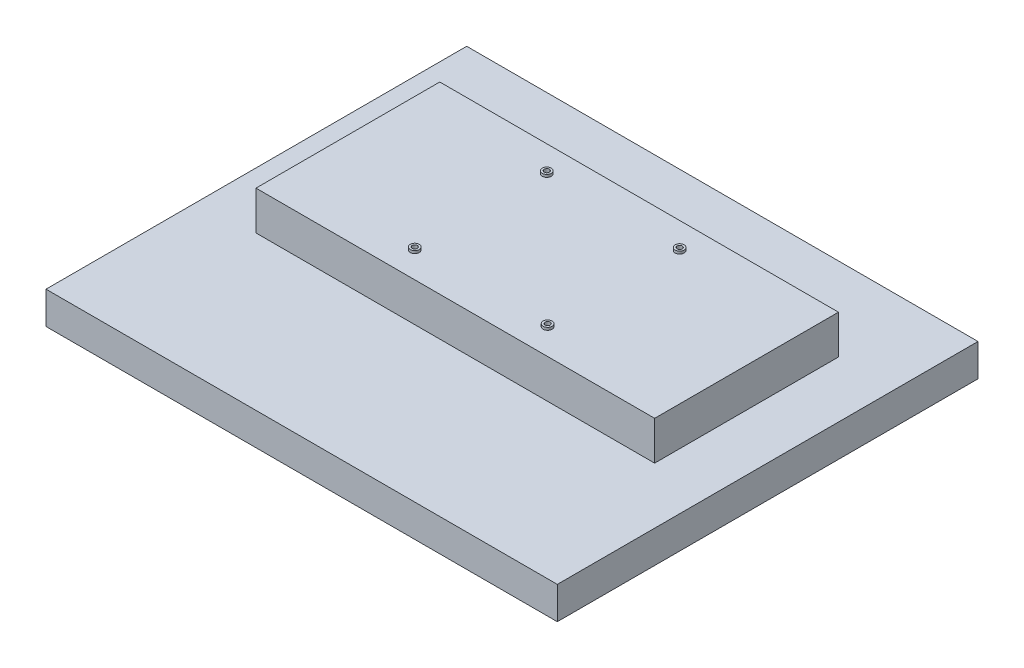
ISO-10303-21;
HEADER;
FILE_DESCRIPTION(('STEP AP214'),'2;1');
FILE_NAME('part.step','',(''),(''),'','','');
FILE_SCHEMA(('AUTOMOTIVE_DESIGN { 1 0 10303 214 1 1 1 1 }'));
ENDSEC;
DATA;
#1=APPLICATION_CONTEXT('core data for automotive mechanical design processes');
#2=APPLICATION_PROTOCOL_DEFINITION('international standard','automotive_design',2000,#1);
#3=PRODUCT_CONTEXT('',#1,'mechanical');
#4=PRODUCT('Part','Part','',(#3));
#5=PRODUCT_RELATED_PRODUCT_CATEGORY('part','',(#4));
#6=PRODUCT_DEFINITION_FORMATION('','',#4);
#7=PRODUCT_DEFINITION_CONTEXT('part definition',#1,'design');
#8=PRODUCT_DEFINITION('design','',#6,#7);
#9=PRODUCT_DEFINITION_SHAPE('','',#8);
#10=(LENGTH_UNIT() NAMED_UNIT(*) SI_UNIT(.MILLI.,.METRE.));
#11=(NAMED_UNIT(*) PLANE_ANGLE_UNIT() SI_UNIT($,.RADIAN.));
#12=(NAMED_UNIT(*) SI_UNIT($,.STERADIAN.) SOLID_ANGLE_UNIT());
#13=UNCERTAINTY_MEASURE_WITH_UNIT(LENGTH_MEASURE(1.E-05),#10,'distance_accuracy_value','');
#14=(GEOMETRIC_REPRESENTATION_CONTEXT(3) GLOBAL_UNCERTAINTY_ASSIGNED_CONTEXT((#13)) GLOBAL_UNIT_ASSIGNED_CONTEXT((#10,
#11,#12)) REPRESENTATION_CONTEXT('',''));
#15=CARTESIAN_POINT('',(0.,0.,0.));
#16=DIRECTION('',(0.,0.,1.));
#17=DIRECTION('',(1.,0.,0.));
#18=AXIS2_PLACEMENT_3D('',#15,#16,#17);
#19=CARTESIAN_POINT('',(0.,25.,0.));
#20=DIRECTION('',(0.,-1.,0.));
#21=DIRECTION('',(0.,0.,-1.));
#22=AXIS2_PLACEMENT_3D('',#19,#20,#21);
#23=PLANE('',#22);
#24=DIRECTION('',(1.,0.,0.));
#25=VECTOR('',#24,1.);
#26=CARTESIAN_POINT('',(0.,25.,-98.2000000000001));
#27=LINE('',#26,#25);
#28=CARTESIAN_POINT('',(-154.,25.,-98.2000000000001));
#29=VERTEX_POINT('',#28);
#30=CARTESIAN_POINT('',(154.,25.,-98.2000000000001));
#31=VERTEX_POINT('',#30);
#32=EDGE_CURVE('E159',#29,#31,#27,.T.);
#33=ORIENTED_EDGE('',*,*,#32,.T.);
#34=DIRECTION('',(0.,0.,1.));
#35=VECTOR('',#34,1.);
#36=CARTESIAN_POINT('',(154.,25.,0.));
#37=LINE('',#36,#35);
#38=CARTESIAN_POINT('',(154.,25.,43.8));
#39=VERTEX_POINT('',#38);
#40=EDGE_CURVE('E54',#31,#39,#37,.T.);
#41=ORIENTED_EDGE('',*,*,#40,.T.);
#42=DIRECTION('',(1.,0.,0.));
#43=VECTOR('',#42,1.);
#44=CARTESIAN_POINT('',(0.,25.,43.7999999999999));
#45=LINE('',#44,#43);
#46=CARTESIAN_POINT('',(-154.,25.,43.7999999999999));
#47=VERTEX_POINT('',#46);
#48=EDGE_CURVE('E165',#47,#39,#45,.T.);
#49=ORIENTED_EDGE('',*,*,#48,.F.);
#50=DIRECTION('',(0.,0.,1.));
#51=VECTOR('',#50,1.);
#52=CARTESIAN_POINT('',(-154.,25.,0.));
#53=LINE('',#52,#51);
#54=EDGE_CURVE('E162',#29,#47,#53,.T.);
#55=ORIENTED_EDGE('',*,*,#54,.F.);
#56=EDGE_LOOP('',(#33,#41,#49,#55));
#57=FACE_BOUND('',#56,.T.);
#58=DIRECTION('',(0.,0.,-1.));
#59=VECTOR('',#58,1.);
#60=CARTESIAN_POINT('',(197.5,25.,162.5));
#61=LINE('',#60,#59);
#62=CARTESIAN_POINT('',(197.5,25.,162.5));
#63=VERTEX_POINT('',#62);
#64=CARTESIAN_POINT('',(197.5,25.,-162.5));
#65=VERTEX_POINT('',#64);
#66=EDGE_CURVE('E203',#63,#65,#61,.T.);
#67=ORIENTED_EDGE('',*,*,#66,.T.);
#68=DIRECTION('',(-1.,0.,0.));
#69=VECTOR('',#68,1.);
#70=CARTESIAN_POINT('',(-197.5,25.,-162.5));
#71=LINE('',#70,#69);
#72=CARTESIAN_POINT('',(-197.5,25.,-162.5));
#73=VERTEX_POINT('',#72);
#74=EDGE_CURVE('E206',#65,#73,#71,.T.);
#75=ORIENTED_EDGE('',*,*,#74,.T.);
#76=DIRECTION('',(0.,0.,1.));
#77=VECTOR('',#76,1.);
#78=CARTESIAN_POINT('',(-197.5,25.,162.5));
#79=LINE('',#78,#77);
#80=CARTESIAN_POINT('',(-197.5,25.,162.5));
#81=VERTEX_POINT('',#80);
#82=EDGE_CURVE('E209',#73,#81,#79,.T.);
#83=ORIENTED_EDGE('',*,*,#82,.T.);
#84=DIRECTION('',(1.,0.,0.));
#85=VECTOR('',#84,1.);
#86=CARTESIAN_POINT('',(-197.5,25.,162.5));
#87=LINE('',#86,#85);
#88=EDGE_CURVE('E211',#81,#63,#87,.T.);
#89=ORIENTED_EDGE('',*,*,#88,.T.);
#90=EDGE_LOOP('',(#67,#75,#83,#89));
#91=FACE_BOUND('',#90,.T.);
#92=ADVANCED_FACE('F39',(#57,#91),#23,.F.);
#93=CARTESIAN_POINT('',(197.5,25.,162.5));
#94=DIRECTION('',(-1.,0.,0.));
#95=DIRECTION('',(0.,0.,1.));
#96=AXIS2_PLACEMENT_3D('',#93,#94,#95);
#97=PLANE('',#96);
#98=DIRECTION('',(0.,0.,-1.));
#99=VECTOR('',#98,1.);
#100=CARTESIAN_POINT('',(197.5,0.,162.5));
#101=LINE('',#100,#99);
#102=CARTESIAN_POINT('',(197.5,0.,162.5));
#103=VERTEX_POINT('',#102);
#104=CARTESIAN_POINT('',(197.5,0.,-162.5));
#105=VERTEX_POINT('',#104);
#106=EDGE_CURVE('E197',#103,#105,#101,.T.);
#107=ORIENTED_EDGE('',*,*,#106,.T.);
#108=DIRECTION('',(0.,-1.,0.));
#109=VECTOR('',#108,1.);
#110=CARTESIAN_POINT('',(197.5,25.,-162.5));
#111=LINE('',#110,#109);
#112=EDGE_CURVE('E11',#65,#105,#111,.T.);
#113=ORIENTED_EDGE('',*,*,#112,.F.);
#114=ORIENTED_EDGE('',*,*,#66,.F.);
#115=DIRECTION('',(0.,-1.,0.));
#116=VECTOR('',#115,1.);
#117=CARTESIAN_POINT('',(197.5,25.,162.5));
#118=LINE('',#117,#116);
#119=EDGE_CURVE('E213',#63,#103,#118,.T.);
#120=ORIENTED_EDGE('',*,*,#119,.T.);
#121=EDGE_LOOP('',(#107,#113,#114,#120));
#122=FACE_BOUND('',#121,.T.);
#123=ADVANCED_FACE('F41',(#122),#97,.F.);
#124=CARTESIAN_POINT('',(-197.5,25.,-162.5));
#125=DIRECTION('',(0.,0.,1.));
#126=DIRECTION('',(1.,0.,0.));
#127=AXIS2_PLACEMENT_3D('',#124,#125,#126);
#128=PLANE('',#127);
#129=DIRECTION('',(-1.,0.,0.));
#130=VECTOR('',#129,1.);
#131=CARTESIAN_POINT('',(-197.5,0.,-162.5));
#132=LINE('',#131,#130);
#133=CARTESIAN_POINT('',(-197.5,0.,-162.5));
#134=VERTEX_POINT('',#133);
#135=EDGE_CURVE('E216',#105,#134,#132,.T.);
#136=ORIENTED_EDGE('',*,*,#135,.T.);
#137=DIRECTION('',(0.,-1.,0.));
#138=VECTOR('',#137,1.);
#139=CARTESIAN_POINT('',(-197.5,25.,-162.5));
#140=LINE('',#139,#138);
#141=EDGE_CURVE('E47',#73,#134,#140,.T.);
#142=ORIENTED_EDGE('',*,*,#141,.F.);
#143=ORIENTED_EDGE('',*,*,#74,.F.);
#144=ORIENTED_EDGE('',*,*,#112,.T.);
#145=EDGE_LOOP('',(#136,#142,#143,#144));
#146=FACE_BOUND('',#145,.T.);
#147=ADVANCED_FACE('F245',(#146),#128,.F.);
#148=CARTESIAN_POINT('',(-197.5,25.,162.5));
#149=DIRECTION('',(1.,0.,0.));
#150=DIRECTION('',(0.,0.,-1.));
#151=AXIS2_PLACEMENT_3D('',#148,#149,#150);
#152=PLANE('',#151);
#153=DIRECTION('',(0.,0.,1.));
#154=VECTOR('',#153,1.);
#155=CARTESIAN_POINT('',(-197.5,0.,162.5));
#156=LINE('',#155,#154);
#157=CARTESIAN_POINT('',(-197.5,0.,162.5));
#158=VERTEX_POINT('',#157);
#159=EDGE_CURVE('E218',#134,#158,#156,.T.);
#160=ORIENTED_EDGE('',*,*,#159,.T.);
#161=DIRECTION('',(0.,-1.,0.));
#162=VECTOR('',#161,1.);
#163=CARTESIAN_POINT('',(-197.5,25.,162.5));
#164=LINE('',#163,#162);
#165=EDGE_CURVE('E223',#81,#158,#164,.T.);
#166=ORIENTED_EDGE('',*,*,#165,.F.);
#167=ORIENTED_EDGE('',*,*,#82,.F.);
#168=ORIENTED_EDGE('',*,*,#141,.T.);
#169=EDGE_LOOP('',(#160,#166,#167,#168));
#170=FACE_BOUND('',#169,.T.);
#171=ADVANCED_FACE('F230',(#170),#152,.F.);
#172=CARTESIAN_POINT('',(-197.5,25.,162.5));
#173=DIRECTION('',(0.,0.,-1.));
#174=DIRECTION('',(-1.,0.,0.));
#175=AXIS2_PLACEMENT_3D('',#172,#173,#174);
#176=PLANE('',#175);
#177=DIRECTION('',(1.,0.,0.));
#178=VECTOR('',#177,1.);
#179=CARTESIAN_POINT('',(-197.5,0.,162.5));
#180=LINE('',#179,#178);
#181=EDGE_CURVE('E207',#158,#103,#180,.T.);
#182=ORIENTED_EDGE('',*,*,#181,.T.);
#183=ORIENTED_EDGE('',*,*,#119,.F.);
#184=ORIENTED_EDGE('',*,*,#88,.F.);
#185=ORIENTED_EDGE('',*,*,#165,.T.);
#186=EDGE_LOOP('',(#182,#183,#184,#185));
#187=FACE_BOUND('',#186,.T.);
#188=ADVANCED_FACE('F239',(#187),#176,.F.);
#189=CARTESIAN_POINT('',(0.,0.,0.));
#190=DIRECTION('',(0.,-1.,0.));
#191=DIRECTION('',(0.,0.,-1.));
#192=AXIS2_PLACEMENT_3D('',#189,#190,#191);
#193=PLANE('',#192);
#194=DIRECTION('',(0.,0.,1.));
#195=VECTOR('',#194,1.);
#196=CARTESIAN_POINT('',(190.,0.,152.5));
#197=LINE('',#196,#195);
#198=CARTESIAN_POINT('',(190.,0.,-152.5));
#199=VERTEX_POINT('',#198);
#200=CARTESIAN_POINT('',(190.,0.,152.5));
#201=VERTEX_POINT('',#200);
#202=EDGE_CURVE('E62',#199,#201,#197,.T.);
#203=ORIENTED_EDGE('',*,*,#202,.F.);
#204=DIRECTION('',(1.,0.,0.));
#205=VECTOR('',#204,1.);
#206=CARTESIAN_POINT('',(-190.,0.,-152.5));
#207=LINE('',#206,#205);
#208=CARTESIAN_POINT('',(-190.,0.,-152.5));
#209=VERTEX_POINT('',#208);
#210=EDGE_CURVE('E176',#209,#199,#207,.T.);
#211=ORIENTED_EDGE('',*,*,#210,.F.);
#212=DIRECTION('',(0.,0.,-1.));
#213=VECTOR('',#212,1.);
#214=CARTESIAN_POINT('',(-190.,0.,152.5));
#215=LINE('',#214,#213);
#216=CARTESIAN_POINT('',(-190.,0.,152.5));
#217=VERTEX_POINT('',#216);
#218=EDGE_CURVE('E190',#217,#209,#215,.T.);
#219=ORIENTED_EDGE('',*,*,#218,.F.);
#220=DIRECTION('',(-1.,0.,0.));
#221=VECTOR('',#220,1.);
#222=CARTESIAN_POINT('',(-190.,0.,152.5));
#223=LINE('',#222,#221);
#224=EDGE_CURVE('E187',#201,#217,#223,.T.);
#225=ORIENTED_EDGE('',*,*,#224,.F.);
#226=EDGE_LOOP('',(#203,#211,#219,#225));
#227=FACE_BOUND('',#226,.T.);
#228=ORIENTED_EDGE('',*,*,#106,.F.);
#229=ORIENTED_EDGE('',*,*,#181,.F.);
#230=ORIENTED_EDGE('',*,*,#159,.F.);
#231=ORIENTED_EDGE('',*,*,#135,.F.);
#232=EDGE_LOOP('',(#228,#229,#230,#231));
#233=FACE_BOUND('',#232,.T.);
#234=ADVANCED_FACE('F236',(#227,#233),#193,.T.);
#235=CARTESIAN_POINT('',(190.,0.8,152.5));
#236=DIRECTION('',(1.,0.,0.));
#237=DIRECTION('',(0.,0.,-1.));
#238=AXIS2_PLACEMENT_3D('',#235,#236,#237);
#239=PLANE('',#238);
#240=ORIENTED_EDGE('',*,*,#202,.T.);
#241=DIRECTION('',(0.,-1.,0.));
#242=VECTOR('',#241,1.);
#243=CARTESIAN_POINT('',(190.,0.8,152.5));
#244=LINE('',#243,#242);
#245=CARTESIAN_POINT('',(190.,0.8,152.5));
#246=VERTEX_POINT('',#245);
#247=EDGE_CURVE('E185',#246,#201,#244,.T.);
#248=ORIENTED_EDGE('',*,*,#247,.F.);
#249=DIRECTION('',(0.,0.,1.));
#250=VECTOR('',#249,1.);
#251=CARTESIAN_POINT('',(190.,0.8,152.5));
#252=LINE('',#251,#250);
#253=CARTESIAN_POINT('',(190.,0.8,-152.5));
#254=VERTEX_POINT('',#253);
#255=EDGE_CURVE('E172',#254,#246,#252,.T.);
#256=ORIENTED_EDGE('',*,*,#255,.F.);
#257=DIRECTION('',(0.,-1.,0.));
#258=VECTOR('',#257,1.);
#259=CARTESIAN_POINT('',(190.,0.8,-152.5));
#260=LINE('',#259,#258);
#261=EDGE_CURVE('E195',#254,#199,#260,.T.);
#262=ORIENTED_EDGE('',*,*,#261,.T.);
#263=EDGE_LOOP('',(#240,#248,#256,#262));
#264=FACE_BOUND('',#263,.T.);
#265=ADVANCED_FACE('F261',(#264),#239,.F.);
#266=CARTESIAN_POINT('',(-190.,0.8,-152.5));
#267=DIRECTION('',(0.,0.,-1.));
#268=DIRECTION('',(-1.,0.,0.));
#269=AXIS2_PLACEMENT_3D('',#266,#267,#268);
#270=PLANE('',#269);
#271=ORIENTED_EDGE('',*,*,#210,.T.);
#272=ORIENTED_EDGE('',*,*,#261,.F.);
#273=DIRECTION('',(1.,0.,0.));
#274=VECTOR('',#273,1.);
#275=CARTESIAN_POINT('',(-190.,0.8,-152.5));
#276=LINE('',#275,#274);
#277=CARTESIAN_POINT('',(-190.,0.8,-152.5));
#278=VERTEX_POINT('',#277);
#279=EDGE_CURVE('E182',#278,#254,#276,.T.);
#280=ORIENTED_EDGE('',*,*,#279,.F.);
#281=DIRECTION('',(0.,-1.,0.));
#282=VECTOR('',#281,1.);
#283=CARTESIAN_POINT('',(-190.,0.8,-152.5));
#284=LINE('',#283,#282);
#285=EDGE_CURVE('E198',#278,#209,#284,.T.);
#286=ORIENTED_EDGE('',*,*,#285,.T.);
#287=EDGE_LOOP('',(#271,#272,#280,#286));
#288=FACE_BOUND('',#287,.T.);
#289=ADVANCED_FACE('F283',(#288),#270,.F.);
#290=CARTESIAN_POINT('',(-190.,0.8,152.5));
#291=DIRECTION('',(-1.,0.,0.));
#292=DIRECTION('',(0.,0.,1.));
#293=AXIS2_PLACEMENT_3D('',#290,#291,#292);
#294=PLANE('',#293);
#295=ORIENTED_EDGE('',*,*,#218,.T.);
#296=ORIENTED_EDGE('',*,*,#285,.F.);
#297=DIRECTION('',(0.,0.,-1.));
#298=VECTOR('',#297,1.);
#299=CARTESIAN_POINT('',(-190.,0.8,152.5));
#300=LINE('',#299,#298);
#301=CARTESIAN_POINT('',(-190.,0.8,152.5));
#302=VERTEX_POINT('',#301);
#303=EDGE_CURVE('E179',#302,#278,#300,.T.);
#304=ORIENTED_EDGE('',*,*,#303,.F.);
#305=DIRECTION('',(0.,-1.,0.));
#306=VECTOR('',#305,1.);
#307=CARTESIAN_POINT('',(-190.,0.8,152.5));
#308=LINE('',#307,#306);
#309=EDGE_CURVE('E200',#302,#217,#308,.T.);
#310=ORIENTED_EDGE('',*,*,#309,.T.);
#311=EDGE_LOOP('',(#295,#296,#304,#310));
#312=FACE_BOUND('',#311,.T.);
#313=ADVANCED_FACE('F290',(#312),#294,.F.);
#314=CARTESIAN_POINT('',(-190.,0.8,152.5));
#315=DIRECTION('',(0.,0.,1.));
#316=DIRECTION('',(1.,0.,0.));
#317=AXIS2_PLACEMENT_3D('',#314,#315,#316);
#318=PLANE('',#317);
#319=ORIENTED_EDGE('',*,*,#224,.T.);
#320=ORIENTED_EDGE('',*,*,#309,.F.);
#321=DIRECTION('',(-1.,0.,0.));
#322=VECTOR('',#321,1.);
#323=CARTESIAN_POINT('',(-190.,0.8,152.5));
#324=LINE('',#323,#322);
#325=EDGE_CURVE('E175',#246,#302,#324,.T.);
#326=ORIENTED_EDGE('',*,*,#325,.F.);
#327=ORIENTED_EDGE('',*,*,#247,.T.);
#328=EDGE_LOOP('',(#319,#320,#326,#327));
#329=FACE_BOUND('',#328,.T.);
#330=ADVANCED_FACE('F299',(#329),#318,.F.);
#331=CARTESIAN_POINT('',(0.,0.8,0.));
#332=DIRECTION('',(0.,-1.,0.));
#333=DIRECTION('',(0.,0.,-1.));
#334=AXIS2_PLACEMENT_3D('',#331,#332,#333);
#335=PLANE('',#334);
#336=ORIENTED_EDGE('',*,*,#255,.T.);
#337=ORIENTED_EDGE('',*,*,#325,.T.);
#338=ORIENTED_EDGE('',*,*,#303,.T.);
#339=ORIENTED_EDGE('',*,*,#279,.T.);
#340=EDGE_LOOP('',(#336,#337,#338,#339));
#341=FACE_BOUND('',#340,.T.);
#342=ADVANCED_FACE('F307',(#341),#335,.T.);
#343=CARTESIAN_POINT('',(154.,55.,0.));
#344=DIRECTION('',(1.,0.,0.));
#345=DIRECTION('',(0.,0.,-1.));
#346=AXIS2_PLACEMENT_3D('',#343,#344,#345);
#347=PLANE('',#346);
#348=ORIENTED_EDGE('',*,*,#40,.F.);
#349=DIRECTION('',(0.,-1.,0.));
#350=VECTOR('',#349,1.);
#351=CARTESIAN_POINT('',(154.,55.,-98.2000000000001));
#352=LINE('',#351,#350);
#353=CARTESIAN_POINT('',(154.,55.,-98.2000000000001));
#354=VERTEX_POINT('',#353);
#355=EDGE_CURVE('E126',#354,#31,#352,.T.);
#356=ORIENTED_EDGE('',*,*,#355,.F.);
#357=DIRECTION('',(0.,0.,1.));
#358=VECTOR('',#357,1.);
#359=CARTESIAN_POINT('',(154.,55.,0.));
#360=LINE('',#359,#358);
#361=CARTESIAN_POINT('',(154.,55.,43.8));
#362=VERTEX_POINT('',#361);
#363=EDGE_CURVE('E129',#354,#362,#360,.T.);
#364=ORIENTED_EDGE('',*,*,#363,.T.);
#365=DIRECTION('',(0.,-1.,0.));
#366=VECTOR('',#365,1.);
#367=CARTESIAN_POINT('',(154.,55.,43.8));
#368=LINE('',#367,#366);
#369=EDGE_CURVE('E157',#362,#39,#368,.T.);
#370=ORIENTED_EDGE('',*,*,#369,.T.);
#371=EDGE_LOOP('',(#348,#356,#364,#370));
#372=FACE_BOUND('',#371,.T.);
#373=ADVANCED_FACE('F128',(#372),#347,.T.);
#374=CARTESIAN_POINT('',(0.,55.,-98.2000000000001));
#375=DIRECTION('',(0.,0.,-1.));
#376=DIRECTION('',(-1.,0.,0.));
#377=AXIS2_PLACEMENT_3D('',#374,#375,#376);
#378=PLANE('',#377);
#379=ORIENTED_EDGE('',*,*,#32,.F.);
#380=DIRECTION('',(0.,-1.,0.));
#381=VECTOR('',#380,1.);
#382=CARTESIAN_POINT('',(-154.,55.,-98.2000000000001));
#383=LINE('',#382,#381);
#384=CARTESIAN_POINT('',(-154.,55.,-98.2000000000001));
#385=VERTEX_POINT('',#384);
#386=EDGE_CURVE('E134',#385,#29,#383,.T.);
#387=ORIENTED_EDGE('',*,*,#386,.F.);
#388=DIRECTION('',(1.,0.,0.));
#389=VECTOR('',#388,1.);
#390=CARTESIAN_POINT('',(0.,55.,-98.2000000000001));
#391=LINE('',#390,#389);
#392=EDGE_CURVE('E141',#385,#354,#391,.T.);
#393=ORIENTED_EDGE('',*,*,#392,.T.);
#394=ORIENTED_EDGE('',*,*,#355,.T.);
#395=EDGE_LOOP('',(#379,#387,#393,#394));
#396=FACE_BOUND('',#395,.T.);
#397=ADVANCED_FACE('F146',(#396),#378,.T.);
#398=CARTESIAN_POINT('',(-154.,55.,0.));
#399=DIRECTION('',(1.,0.,0.));
#400=DIRECTION('',(0.,0.,-1.));
#401=AXIS2_PLACEMENT_3D('',#398,#399,#400);
#402=PLANE('',#401);
#403=ORIENTED_EDGE('',*,*,#54,.T.);
#404=DIRECTION('',(0.,-1.,0.));
#405=VECTOR('',#404,1.);
#406=CARTESIAN_POINT('',(-154.,55.,43.7999999999999));
#407=LINE('',#406,#405);
#408=CARTESIAN_POINT('',(-154.,55.,43.7999999999999));
#409=VERTEX_POINT('',#408);
#410=EDGE_CURVE('E169',#409,#47,#407,.T.);
#411=ORIENTED_EDGE('',*,*,#410,.F.);
#412=DIRECTION('',(0.,0.,1.));
#413=VECTOR('',#412,1.);
#414=CARTESIAN_POINT('',(-154.,55.,0.));
#415=LINE('',#414,#413);
#416=EDGE_CURVE('E148',#385,#409,#415,.T.);
#417=ORIENTED_EDGE('',*,*,#416,.F.);
#418=ORIENTED_EDGE('',*,*,#386,.T.);
#419=EDGE_LOOP('',(#403,#411,#417,#418));
#420=FACE_BOUND('',#419,.T.);
#421=ADVANCED_FACE('F337',(#420),#402,.F.);
#422=CARTESIAN_POINT('',(0.,55.,43.7999999999999));
#423=DIRECTION('',(0.,0.,-1.));
#424=DIRECTION('',(-1.,0.,0.));
#425=AXIS2_PLACEMENT_3D('',#422,#423,#424);
#426=PLANE('',#425);
#427=ORIENTED_EDGE('',*,*,#48,.T.);
#428=ORIENTED_EDGE('',*,*,#369,.F.);
#429=DIRECTION('',(1.,0.,0.));
#430=VECTOR('',#429,1.);
#431=CARTESIAN_POINT('',(0.,55.,43.7999999999999));
#432=LINE('',#431,#430);
#433=EDGE_CURVE('E142',#409,#362,#432,.T.);
#434=ORIENTED_EDGE('',*,*,#433,.F.);
#435=ORIENTED_EDGE('',*,*,#410,.T.);
#436=EDGE_LOOP('',(#427,#428,#434,#435));
#437=FACE_BOUND('',#436,.T.);
#438=ADVANCED_FACE('F346',(#437),#426,.F.);
#439=CARTESIAN_POINT('',(0.,55.,0.));
#440=DIRECTION('',(0.,1.,0.));
#441=DIRECTION('',(0.,0.,1.));
#442=AXIS2_PLACEMENT_3D('',#439,#440,#441);
#443=PLANE('',#442);
#444=CARTESIAN_POINT('',(51.3333333333333,55.,-78.2));
#445=DIRECTION('',(0.,1.,0.));
#446=DIRECTION('',(0.,0.,1.));
#447=AXIS2_PLACEMENT_3D('',#444,#445,#446);
#448=CIRCLE('',#447,3.5);
#449=CARTESIAN_POINT('',(51.3333333333333,55.,-74.7));
#450=VERTEX_POINT('',#449);
#451=EDGE_CURVE('E555',#450,#450,#448,.T.);
#452=ORIENTED_EDGE('',*,*,#451,.F.);
#453=EDGE_LOOP('',(#452));
#454=FACE_BOUND('',#453,.T.);
#455=CARTESIAN_POINT('',(-51.3333333333333,55.,-78.2000000000001));
#456=DIRECTION('',(0.,1.,0.));
#457=DIRECTION('',(0.,0.,1.));
#458=AXIS2_PLACEMENT_3D('',#455,#456,#457);
#459=CIRCLE('',#458,3.5);
#460=CARTESIAN_POINT('',(-51.3333333333333,55.,-74.7000000000001));
#461=VERTEX_POINT('',#460);
#462=EDGE_CURVE('E144',#461,#461,#459,.T.);
#463=ORIENTED_EDGE('',*,*,#462,.F.);
#464=EDGE_LOOP('',(#463));
#465=FACE_BOUND('',#464,.T.);
#466=ORIENTED_EDGE('',*,*,#363,.F.);
#467=ORIENTED_EDGE('',*,*,#392,.F.);
#468=ORIENTED_EDGE('',*,*,#416,.T.);
#469=ORIENTED_EDGE('',*,*,#433,.T.);
#470=EDGE_LOOP('',(#466,#467,#468,#469));
#471=FACE_BOUND('',#470,.T.);
#472=CARTESIAN_POINT('',(51.3333333333333,55.,23.7999999999999));
#473=DIRECTION('',(0.,1.,0.));
#474=DIRECTION('',(0.,0.,1.));
#475=AXIS2_PLACEMENT_3D('',#472,#473,#474);
#476=CIRCLE('',#475,3.5);
#477=CARTESIAN_POINT('',(51.3333333333333,55.,27.2999999999999));
#478=VERTEX_POINT('',#477);
#479=EDGE_CURVE('E154',#478,#478,#476,.T.);
#480=ORIENTED_EDGE('',*,*,#479,.F.);
#481=EDGE_LOOP('',(#480));
#482=FACE_BOUND('',#481,.T.);
#483=CARTESIAN_POINT('',(-51.3333333333333,55.,23.7999999999999));
#484=DIRECTION('',(0.,1.,0.));
#485=DIRECTION('',(0.,0.,1.));
#486=AXIS2_PLACEMENT_3D('',#483,#484,#485);
#487=CIRCLE('',#486,3.5);
#488=CARTESIAN_POINT('',(-51.3333333333333,55.,27.2999999999999));
#489=VERTEX_POINT('',#488);
#490=EDGE_CURVE('E160',#489,#489,#487,.T.);
#491=ORIENTED_EDGE('',*,*,#490,.F.);
#492=EDGE_LOOP('',(#491));
#493=FACE_BOUND('',#492,.T.);
#494=ADVANCED_FACE('F138',(#454,#465,#471,#482,#493),#443,.T.);
#495=CARTESIAN_POINT('',(-51.3333333333333,57.,23.7999999999999));
#496=DIRECTION('',(0.,-1.,0.));
#497=DIRECTION('',(0.,0.,-1.));
#498=AXIS2_PLACEMENT_3D('',#495,#496,#497);
#499=CYLINDRICAL_SURFACE('',#498,3.5);
#500=ORIENTED_EDGE('',*,*,#490,.T.);
#501=EDGE_LOOP('',(#500));
#502=FACE_BOUND('',#501,.T.);
#503=CARTESIAN_POINT('',(-51.3333333333333,57.,23.7999999999999));
#504=DIRECTION('',(0.,1.,0.));
#505=DIRECTION('',(0.,0.,1.));
#506=AXIS2_PLACEMENT_3D('',#503,#504,#505);
#507=CIRCLE('',#506,3.5);
#508=CARTESIAN_POINT('',(-51.3333333333333,57.,27.2999999999999));
#509=VERTEX_POINT('',#508);
#510=EDGE_CURVE('E561',#509,#509,#507,.F.);
#511=ORIENTED_EDGE('',*,*,#510,.T.);
#512=EDGE_LOOP('',(#511));
#513=FACE_BOUND('',#512,.T.);
#514=ADVANCED_FACE('F365',(#502,#513),#499,.T.);
#515=CARTESIAN_POINT('',(0.,57.,0.));
#516=DIRECTION('',(0.,1.,0.));
#517=DIRECTION('',(0.,0.,1.));
#518=AXIS2_PLACEMENT_3D('',#515,#516,#517);
#519=PLANE('',#518);
#520=CARTESIAN_POINT('',(-51.3333333333333,57.,23.7999999999999));
#521=DIRECTION('',(0.,1.,0.));
#522=DIRECTION('',(0.,0.,1.));
#523=AXIS2_PLACEMENT_3D('',#520,#521,#522);
#524=CIRCLE('',#523,2.);
#525=CARTESIAN_POINT('',(-51.3333333333333,57.,25.7999999999999));
#526=VERTEX_POINT('',#525);
#527=EDGE_CURVE('E531',#526,#526,#524,.T.);
#528=ORIENTED_EDGE('',*,*,#527,.F.);
#529=EDGE_LOOP('',(#528));
#530=FACE_BOUND('',#529,.T.);
#531=ORIENTED_EDGE('',*,*,#510,.F.);
#532=EDGE_LOOP('',(#531));
#533=FACE_BOUND('',#532,.T.);
#534=ADVANCED_FACE('F375',(#530,#533),#519,.T.);
#535=CARTESIAN_POINT('',(51.3333333333333,57.,23.7999999999999));
#536=DIRECTION('',(0.,-1.,0.));
#537=DIRECTION('',(0.,0.,-1.));
#538=AXIS2_PLACEMENT_3D('',#535,#536,#537);
#539=CYLINDRICAL_SURFACE('',#538,3.5);
#540=ORIENTED_EDGE('',*,*,#479,.T.);
#541=EDGE_LOOP('',(#540));
#542=FACE_BOUND('',#541,.T.);
#543=CARTESIAN_POINT('',(51.3333333333333,57.,23.7999999999999));
#544=DIRECTION('',(0.,1.,0.));
#545=DIRECTION('',(0.,0.,1.));
#546=AXIS2_PLACEMENT_3D('',#543,#544,#545);
#547=CIRCLE('',#546,3.5);
#548=CARTESIAN_POINT('',(51.3333333333333,57.,27.2999999999999));
#549=VERTEX_POINT('',#548);
#550=EDGE_CURVE('E558',#549,#549,#547,.T.);
#551=ORIENTED_EDGE('',*,*,#550,.F.);
#552=EDGE_LOOP('',(#551));
#553=FACE_BOUND('',#552,.T.);
#554=ADVANCED_FACE('F386',(#542,#553),#539,.T.);
#555=CARTESIAN_POINT('',(0.,57.,0.));
#556=DIRECTION('',(0.,1.,0.));
#557=DIRECTION('',(0.,0.,1.));
#558=AXIS2_PLACEMENT_3D('',#555,#556,#557);
#559=PLANE('',#558);
#560=CARTESIAN_POINT('',(51.3333333333333,57.,23.7999999999999));
#561=DIRECTION('',(0.,1.,0.));
#562=DIRECTION('',(0.,0.,1.));
#563=AXIS2_PLACEMENT_3D('',#560,#561,#562);
#564=CIRCLE('',#563,2.);
#565=CARTESIAN_POINT('',(51.3333333333333,57.,25.7999999999999));
#566=VERTEX_POINT('',#565);
#567=EDGE_CURVE('E532',#566,#566,#564,.T.);
#568=ORIENTED_EDGE('',*,*,#567,.F.);
#569=EDGE_LOOP('',(#568));
#570=FACE_BOUND('',#569,.T.);
#571=ORIENTED_EDGE('',*,*,#550,.T.);
#572=EDGE_LOOP('',(#571));
#573=FACE_BOUND('',#572,.T.);
#574=ADVANCED_FACE('F397',(#570,#573),#559,.T.);
#575=CARTESIAN_POINT('',(51.3333333333333,57.,-78.2));
#576=DIRECTION('',(0.,-1.,0.));
#577=DIRECTION('',(0.,0.,-1.));
#578=AXIS2_PLACEMENT_3D('',#575,#576,#577);
#579=CYLINDRICAL_SURFACE('',#578,3.5);
#580=ORIENTED_EDGE('',*,*,#451,.T.);
#581=EDGE_LOOP('',(#580));
#582=FACE_BOUND('',#581,.T.);
#583=CARTESIAN_POINT('',(51.3333333333333,57.,-78.2));
#584=DIRECTION('',(0.,1.,0.));
#585=DIRECTION('',(0.,0.,1.));
#586=AXIS2_PLACEMENT_3D('',#583,#584,#585);
#587=CIRCLE('',#586,3.5);
#588=CARTESIAN_POINT('',(51.3333333333333,57.,-74.7));
#589=VERTEX_POINT('',#588);
#590=EDGE_CURVE('E552',#589,#589,#587,.F.);
#591=ORIENTED_EDGE('',*,*,#590,.T.);
#592=EDGE_LOOP('',(#591));
#593=FACE_BOUND('',#592,.T.);
#594=ADVANCED_FACE('F407',(#582,#593),#579,.T.);
#595=CARTESIAN_POINT('',(0.,57.,0.));
#596=DIRECTION('',(0.,1.,0.));
#597=DIRECTION('',(0.,0.,1.));
#598=AXIS2_PLACEMENT_3D('',#595,#596,#597);
#599=PLANE('',#598);
#600=CARTESIAN_POINT('',(51.3333333333333,57.,-78.2));
#601=DIRECTION('',(0.,1.,0.));
#602=DIRECTION('',(0.,0.,1.));
#603=AXIS2_PLACEMENT_3D('',#600,#601,#602);
#604=CIRCLE('',#603,2.);
#605=CARTESIAN_POINT('',(51.3333333333333,57.,-76.2));
#606=VERTEX_POINT('',#605);
#607=EDGE_CURVE('E549',#606,#606,#604,.T.);
#608=ORIENTED_EDGE('',*,*,#607,.F.);
#609=EDGE_LOOP('',(#608));
#610=FACE_BOUND('',#609,.T.);
#611=ORIENTED_EDGE('',*,*,#590,.F.);
#612=EDGE_LOOP('',(#611));
#613=FACE_BOUND('',#612,.T.);
#614=ADVANCED_FACE('F417',(#610,#613),#599,.T.);
#615=CARTESIAN_POINT('',(-51.3333333333333,57.,-78.2000000000001));
#616=DIRECTION('',(0.,-1.,0.));
#617=DIRECTION('',(0.,0.,-1.));
#618=AXIS2_PLACEMENT_3D('',#615,#616,#617);
#619=CYLINDRICAL_SURFACE('',#618,3.5);
#620=ORIENTED_EDGE('',*,*,#462,.T.);
#621=EDGE_LOOP('',(#620));
#622=FACE_BOUND('',#621,.T.);
#623=CARTESIAN_POINT('',(-51.3333333333333,57.,-78.2000000000001));
#624=DIRECTION('',(0.,1.,0.));
#625=DIRECTION('',(0.,0.,1.));
#626=AXIS2_PLACEMENT_3D('',#623,#624,#625);
#627=CIRCLE('',#626,3.5);
#628=CARTESIAN_POINT('',(-51.3333333333333,57.,-74.7000000000001));
#629=VERTEX_POINT('',#628);
#630=EDGE_CURVE('E545',#629,#629,#627,.T.);
#631=ORIENTED_EDGE('',*,*,#630,.F.);
#632=EDGE_LOOP('',(#631));
#633=FACE_BOUND('',#632,.T.);
#634=ADVANCED_FACE('F426',(#622,#633),#619,.T.);
#635=CARTESIAN_POINT('',(0.,57.,0.));
#636=DIRECTION('',(0.,1.,0.));
#637=DIRECTION('',(0.,0.,1.));
#638=AXIS2_PLACEMENT_3D('',#635,#636,#637);
#639=PLANE('',#638);
#640=CARTESIAN_POINT('',(-51.3333333333333,57.,-78.2000000000001));
#641=DIRECTION('',(0.,1.,0.));
#642=DIRECTION('',(0.,0.,1.));
#643=AXIS2_PLACEMENT_3D('',#640,#641,#642);
#644=CIRCLE('',#643,2.);
#645=CARTESIAN_POINT('',(-51.3333333333333,57.,-76.2000000000001));
#646=VERTEX_POINT('',#645);
#647=EDGE_CURVE('E546',#646,#646,#644,.T.);
#648=ORIENTED_EDGE('',*,*,#647,.F.);
#649=EDGE_LOOP('',(#648));
#650=FACE_BOUND('',#649,.T.);
#651=ORIENTED_EDGE('',*,*,#630,.T.);
#652=EDGE_LOOP('',(#651));
#653=FACE_BOUND('',#652,.T.);
#654=ADVANCED_FACE('F436',(#650,#653),#639,.T.);
#655=CARTESIAN_POINT('',(-51.3333333333333,47.,-78.2000000000001));
#656=DIRECTION('',(0.,1.,0.));
#657=DIRECTION('',(0.,0.,1.));
#658=AXIS2_PLACEMENT_3D('',#655,#656,#657);
#659=CYLINDRICAL_SURFACE('',#658,2.);
#660=CARTESIAN_POINT('',(-51.3333333333333,47.,-78.2000000000001));
#661=DIRECTION('',(0.,1.,0.));
#662=DIRECTION('',(0.,0.,1.));
#663=AXIS2_PLACEMENT_3D('',#660,#661,#662);
#664=CIRCLE('',#663,2.);
#665=CARTESIAN_POINT('',(-51.3333333333333,47.,-76.2000000000001));
#666=VERTEX_POINT('',#665);
#667=EDGE_CURVE('E542',#666,#666,#664,.T.);
#668=ORIENTED_EDGE('',*,*,#667,.F.);
#669=EDGE_LOOP('',(#668));
#670=FACE_BOUND('',#669,.T.);
#671=ORIENTED_EDGE('',*,*,#647,.T.);
#672=EDGE_LOOP('',(#671));
#673=FACE_BOUND('',#672,.T.);
#674=ADVANCED_FACE('F445',(#670,#673),#659,.F.);
#675=CARTESIAN_POINT('',(-51.3333333333333,47.,-78.2000000000001));
#676=DIRECTION('',(0.,1.,0.));
#677=DIRECTION('',(0.,0.,1.));
#678=AXIS2_PLACEMENT_3D('',#675,#676,#677);
#679=PLANE('',#678);
#680=ORIENTED_EDGE('',*,*,#667,.T.);
#681=EDGE_LOOP('',(#680));
#682=FACE_BOUND('',#681,.T.);
#683=ADVANCED_FACE('F455',(#682),#679,.T.);
#684=CARTESIAN_POINT('',(51.3333333333333,47.,-78.2));
#685=DIRECTION('',(0.,1.,0.));
#686=DIRECTION('',(0.,0.,1.));
#687=AXIS2_PLACEMENT_3D('',#684,#685,#686);
#688=CYLINDRICAL_SURFACE('',#687,2.);
#689=CARTESIAN_POINT('',(51.3333333333333,47.,-78.2));
#690=DIRECTION('',(0.,1.,0.));
#691=DIRECTION('',(0.,0.,1.));
#692=AXIS2_PLACEMENT_3D('',#689,#690,#691);
#693=CIRCLE('',#692,2.);
#694=CARTESIAN_POINT('',(51.3333333333333,47.,-76.2));
#695=VERTEX_POINT('',#694);
#696=EDGE_CURVE('E535',#695,#695,#693,.T.);
#697=ORIENTED_EDGE('',*,*,#696,.F.);
#698=EDGE_LOOP('',(#697));
#699=FACE_BOUND('',#698,.T.);
#700=ORIENTED_EDGE('',*,*,#607,.T.);
#701=EDGE_LOOP('',(#700));
#702=FACE_BOUND('',#701,.T.);
#703=ADVANCED_FACE('F465',(#699,#702),#688,.F.);
#704=CARTESIAN_POINT('',(51.3333333333333,47.,-78.2));
#705=DIRECTION('',(0.,1.,0.));
#706=DIRECTION('',(0.,0.,1.));
#707=AXIS2_PLACEMENT_3D('',#704,#705,#706);
#708=PLANE('',#707);
#709=ORIENTED_EDGE('',*,*,#696,.T.);
#710=EDGE_LOOP('',(#709));
#711=FACE_BOUND('',#710,.T.);
#712=ADVANCED_FACE('F475',(#711),#708,.T.);
#713=CARTESIAN_POINT('',(51.3333333333333,47.,23.7999999999999));
#714=DIRECTION('',(0.,1.,0.));
#715=DIRECTION('',(0.,0.,1.));
#716=AXIS2_PLACEMENT_3D('',#713,#714,#715);
#717=CYLINDRICAL_SURFACE('',#716,2.);
#718=CARTESIAN_POINT('',(51.3333333333333,47.,23.7999999999999));
#719=DIRECTION('',(0.,1.,0.));
#720=DIRECTION('',(0.,0.,1.));
#721=AXIS2_PLACEMENT_3D('',#718,#719,#720);
#722=CIRCLE('',#721,2.);
#723=CARTESIAN_POINT('',(51.3333333333333,47.,25.7999999999999));
#724=VERTEX_POINT('',#723);
#725=EDGE_CURVE('E538',#724,#724,#722,.T.);
#726=ORIENTED_EDGE('',*,*,#725,.F.);
#727=EDGE_LOOP('',(#726));
#728=FACE_BOUND('',#727,.T.);
#729=ORIENTED_EDGE('',*,*,#567,.T.);
#730=EDGE_LOOP('',(#729));
#731=FACE_BOUND('',#730,.T.);
#732=ADVANCED_FACE('F485',(#728,#731),#717,.F.);
#733=CARTESIAN_POINT('',(51.3333333333333,47.,23.7999999999999));
#734=DIRECTION('',(0.,1.,0.));
#735=DIRECTION('',(0.,0.,1.));
#736=AXIS2_PLACEMENT_3D('',#733,#734,#735);
#737=PLANE('',#736);
#738=ORIENTED_EDGE('',*,*,#725,.T.);
#739=EDGE_LOOP('',(#738));
#740=FACE_BOUND('',#739,.T.);
#741=ADVANCED_FACE('F495',(#740),#737,.T.);
#742=CARTESIAN_POINT('',(-51.3333333333333,47.,23.7999999999999));
#743=DIRECTION('',(0.,1.,0.));
#744=DIRECTION('',(0.,0.,1.));
#745=AXIS2_PLACEMENT_3D('',#742,#743,#744);
#746=CYLINDRICAL_SURFACE('',#745,2.);
#747=CARTESIAN_POINT('',(-51.3333333333333,47.,23.7999999999999));
#748=DIRECTION('',(0.,1.,0.));
#749=DIRECTION('',(0.,0.,1.));
#750=AXIS2_PLACEMENT_3D('',#747,#748,#749);
#751=CIRCLE('',#750,2.);
#752=CARTESIAN_POINT('',(-51.3333333333333,47.,25.7999999999999));
#753=VERTEX_POINT('',#752);
#754=EDGE_CURVE('E530',#753,#753,#751,.T.);
#755=ORIENTED_EDGE('',*,*,#754,.F.);
#756=EDGE_LOOP('',(#755));
#757=FACE_BOUND('',#756,.T.);
#758=ORIENTED_EDGE('',*,*,#527,.T.);
#759=EDGE_LOOP('',(#758));
#760=FACE_BOUND('',#759,.T.);
#761=ADVANCED_FACE('F505',(#757,#760),#746,.F.);
#762=CARTESIAN_POINT('',(-51.3333333333333,47.,23.7999999999999));
#763=DIRECTION('',(0.,1.,0.));
#764=DIRECTION('',(0.,0.,1.));
#765=AXIS2_PLACEMENT_3D('',#762,#763,#764);
#766=PLANE('',#765);
#767=ORIENTED_EDGE('',*,*,#754,.T.);
#768=EDGE_LOOP('',(#767));
#769=FACE_BOUND('',#768,.T.);
#770=ADVANCED_FACE('F515',(#769),#766,.T.);
#771=CLOSED_SHELL('',(#92,#123,#147,#171,#188,#234,#265,#289,#313,#330,#342,#373,#397,#421,#438,
#494,#514,#534,#554,#574,#594,#614,#634,#654,#674,#683,#703,#712,#732,#741,#761,#770));
#772=MANIFOLD_SOLID_BREP('B2',#771);
#773=ADVANCED_BREP_SHAPE_REPRESENTATION('',(#18,#772),#14);
#774=SHAPE_DEFINITION_REPRESENTATION(#9,#773);
ENDSEC;
END-ISO-10303-21;
